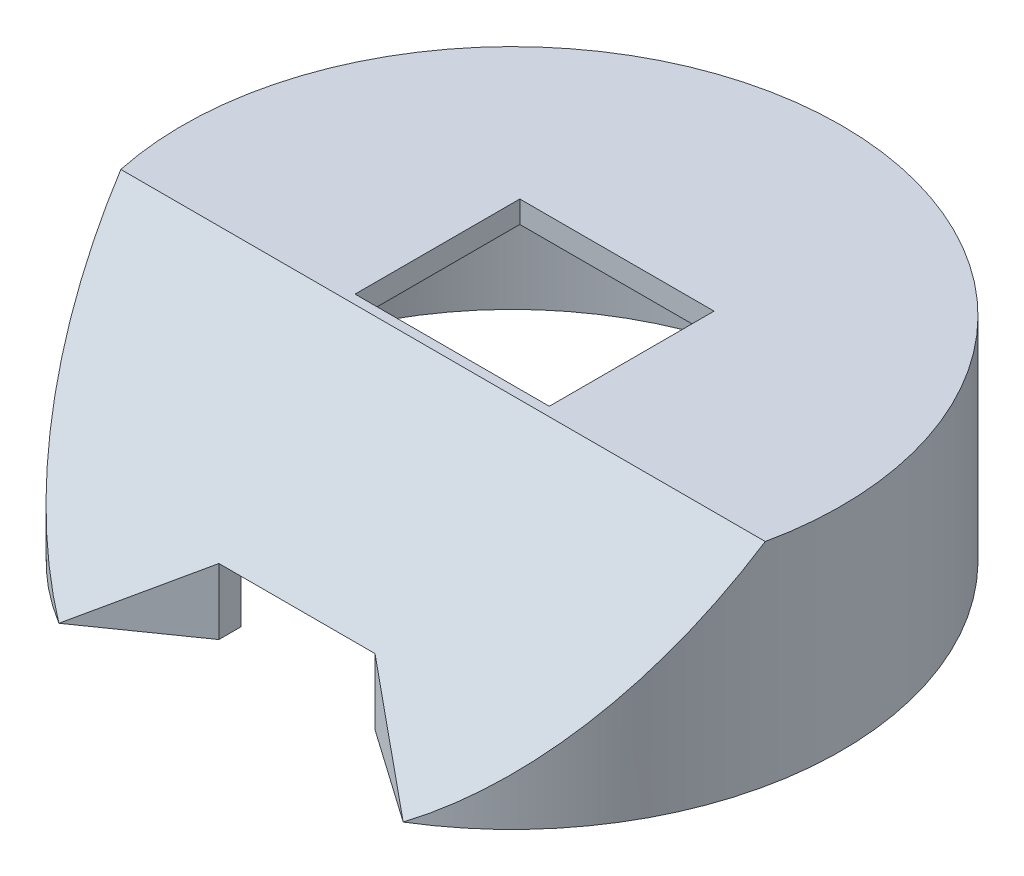
ISO-10303-21;
HEADER;
FILE_DESCRIPTION(('STEP AP214'),'2;1');
FILE_NAME('part.step','',(''),(''),'','','');
FILE_SCHEMA(('AUTOMOTIVE_DESIGN { 1 0 10303 214 1 1 1 1 }'));
ENDSEC;
DATA;
#1=APPLICATION_CONTEXT('core data for automotive mechanical design processes');
#2=APPLICATION_PROTOCOL_DEFINITION('international standard','automotive_design',2000,#1);
#3=PRODUCT_CONTEXT('',#1,'mechanical');
#4=PRODUCT('Part','Part','',(#3));
#5=PRODUCT_RELATED_PRODUCT_CATEGORY('part','',(#4));
#6=PRODUCT_DEFINITION_FORMATION('','',#4);
#7=PRODUCT_DEFINITION_CONTEXT('part definition',#1,'design');
#8=PRODUCT_DEFINITION('design','',#6,#7);
#9=PRODUCT_DEFINITION_SHAPE('','',#8);
#10=(LENGTH_UNIT() NAMED_UNIT(*) SI_UNIT(.MILLI.,.METRE.));
#11=(NAMED_UNIT(*) PLANE_ANGLE_UNIT() SI_UNIT($,.RADIAN.));
#12=(NAMED_UNIT(*) SI_UNIT($,.STERADIAN.) SOLID_ANGLE_UNIT());
#13=UNCERTAINTY_MEASURE_WITH_UNIT(LENGTH_MEASURE(1.E-05),#10,'distance_accuracy_value','');
#14=(GEOMETRIC_REPRESENTATION_CONTEXT(3) GLOBAL_UNCERTAINTY_ASSIGNED_CONTEXT((#13)) GLOBAL_UNIT_ASSIGNED_CONTEXT((#10,
#11,#12)) REPRESENTATION_CONTEXT('',''));
#15=CARTESIAN_POINT('',(0.,0.,0.));
#16=DIRECTION('',(0.,0.,1.));
#17=DIRECTION('',(1.,0.,0.));
#18=AXIS2_PLACEMENT_3D('',#15,#16,#17);
#19=CARTESIAN_POINT('',(0.,122.25,0.));
#20=DIRECTION('',(0.,1.,0.));
#21=DIRECTION('',(0.,0.,1.));
#22=AXIS2_PLACEMENT_3D('',#19,#20,#21);
#23=PLANE('',#22);
#24=DIRECTION('',(1.,0.,0.));
#25=VECTOR('',#24,1.);
#26=CARTESIAN_POINT('',(-190.000025,122.25,39.7547522635531));
#27=LINE('',#26,#25);
#28=CARTESIAN_POINT('',(-185.794401617658,122.25,39.7547522635531));
#29=VERTEX_POINT('',#28);
#30=CARTESIAN_POINT('',(185.794401617658,122.25,39.7547522635531));
#31=VERTEX_POINT('',#30);
#32=EDGE_CURVE('E262',#29,#31,#27,.T.);
#33=ORIENTED_EDGE('',*,*,#32,.T.);
#34=CARTESIAN_POINT('',(0.,122.25,0.));
#35=DIRECTION('',(0.,1.,0.));
#36=DIRECTION('',(0.,0.,1.));
#37=AXIS2_PLACEMENT_3D('',#34,#35,#36);
#38=CIRCLE('',#37,190.);
#39=EDGE_CURVE('E296',#31,#29,#38,.T.);
#40=ORIENTED_EDGE('',*,*,#39,.T.);
#41=EDGE_LOOP('',(#33,#40));
#42=FACE_BOUND('',#41,.T.);
#43=DIRECTION('',(-1.,0.,0.));
#44=VECTOR('',#43,1.);
#45=CARTESIAN_POINT('',(0.,122.25,-60.5057599785852));
#46=LINE('',#45,#44);
#47=CARTESIAN_POINT('',(56.,122.25,-60.5057599785852));
#48=VERTEX_POINT('',#47);
#49=CARTESIAN_POINT('',(-56.,122.25,-60.5057599785852));
#50=VERTEX_POINT('',#49);
#51=EDGE_CURVE('E363',#48,#50,#46,.T.);
#52=ORIENTED_EDGE('',*,*,#51,.F.);
#53=DIRECTION('',(0.,0.,1.));
#54=VECTOR('',#53,1.);
#55=CARTESIAN_POINT('',(56.,122.25,0.));
#56=LINE('',#55,#54);
#57=CARTESIAN_POINT('',(56.,122.25,34.4942400214148));
#58=VERTEX_POINT('',#57);
#59=EDGE_CURVE('E348',#48,#58,#56,.T.);
#60=ORIENTED_EDGE('',*,*,#59,.T.);
#61=DIRECTION('',(1.,0.,0.));
#62=VECTOR('',#61,1.);
#63=CARTESIAN_POINT('',(0.,122.25,34.4942400214148));
#64=LINE('',#63,#62);
#65=CARTESIAN_POINT('',(-56.,122.25,34.4942400214148));
#66=VERTEX_POINT('',#65);
#67=EDGE_CURVE('E352',#66,#58,#64,.T.);
#68=ORIENTED_EDGE('',*,*,#67,.F.);
#69=DIRECTION('',(0.,0.,1.));
#70=VECTOR('',#69,1.);
#71=CARTESIAN_POINT('',(-56.,122.25,0.));
#72=LINE('',#71,#70);
#73=EDGE_CURVE('E170',#50,#66,#72,.T.);
#74=ORIENTED_EDGE('',*,*,#73,.F.);
#75=EDGE_LOOP('',(#52,#60,#68,#74));
#76=FACE_BOUND('',#75,.T.);
#77=ADVANCED_FACE('F45',(#42,#76),#23,.T.);
#78=CARTESIAN_POINT('',(0.,109.55,0.));
#79=DIRECTION('',(0.,1.,0.));
#80=DIRECTION('',(0.,0.,1.));
#81=AXIS2_PLACEMENT_3D('',#78,#79,#80);
#82=PLANE('',#81);
#83=DIRECTION('',(0.,0.,1.));
#84=VECTOR('',#83,1.);
#85=CARTESIAN_POINT('',(56.,109.55,0.));
#86=LINE('',#85,#84);
#87=CARTESIAN_POINT('',(56.,109.55,-60.5057599785852));
#88=VERTEX_POINT('',#87);
#89=CARTESIAN_POINT('',(56.,109.55,34.4942400214148));
#90=VERTEX_POINT('',#89);
#91=EDGE_CURVE('E11',#88,#90,#86,.T.);
#92=ORIENTED_EDGE('',*,*,#91,.F.);
#93=DIRECTION('',(-1.,0.,0.));
#94=VECTOR('',#93,1.);
#95=CARTESIAN_POINT('',(0.,109.55,-60.5057599785852));
#96=LINE('',#95,#94);
#97=CARTESIAN_POINT('',(-56.,109.55,-60.5057599785852));
#98=VERTEX_POINT('',#97);
#99=EDGE_CURVE('E54',#88,#98,#96,.T.);
#100=ORIENTED_EDGE('',*,*,#99,.T.);
#101=DIRECTION('',(0.,0.,1.));
#102=VECTOR('',#101,1.);
#103=CARTESIAN_POINT('',(-56.,109.55,0.));
#104=LINE('',#103,#102);
#105=CARTESIAN_POINT('',(-56.,109.55,34.4942400214148));
#106=VERTEX_POINT('',#105);
#107=EDGE_CURVE('E167',#98,#106,#104,.T.);
#108=ORIENTED_EDGE('',*,*,#107,.T.);
#109=DIRECTION('',(1.,0.,0.));
#110=VECTOR('',#109,1.);
#111=CARTESIAN_POINT('',(-190.000025,109.55,34.4942400214148));
#112=LINE('',#111,#110);
#113=CARTESIAN_POINT('',(-173.912154277224,109.55,34.4942400214148));
#114=VERTEX_POINT('',#113);
#115=EDGE_CURVE('E160',#114,#106,#112,.T.);
#116=ORIENTED_EDGE('',*,*,#115,.F.);
#117=CARTESIAN_POINT('',(0.,109.55,0.));
#118=DIRECTION('',(0.,1.,0.));
#119=DIRECTION('',(0.,0.,1.));
#120=AXIS2_PLACEMENT_3D('',#117,#118,#119);
#121=CIRCLE('',#120,177.3);
#122=CARTESIAN_POINT('',(173.912154277224,109.55,34.4942400214148));
#123=VERTEX_POINT('',#122);
#124=EDGE_CURVE('E215',#123,#114,#121,.T.);
#125=ORIENTED_EDGE('',*,*,#124,.F.);
#126=EDGE_CURVE('E161',#90,#123,#112,.T.);
#127=ORIENTED_EDGE('',*,*,#126,.F.);
#128=EDGE_LOOP('',(#92,#100,#108,#116,#125,#127));
#129=FACE_BOUND('',#128,.T.);
#130=ADVANCED_FACE('F178',(#129),#82,.F.);
#131=CARTESIAN_POINT('',(0.,122.25,111.304758263554));
#132=DIRECTION('',(0.,0.,-1.));
#133=DIRECTION('',(-1.,0.,0.));
#134=AXIS2_PLACEMENT_3D('',#131,#132,#133);
#135=PLANE('',#134);
#136=DIRECTION('',(0.,1.,0.));
#137=VECTOR('',#136,1.);
#138=CARTESIAN_POINT('',(-45.,122.25,111.304758263554));
#139=LINE('',#138,#137);
#140=CARTESIAN_POINT('',(-45.,0.,111.304758263554));
#141=VERTEX_POINT('',#140);
#142=CARTESIAN_POINT('',(-45.,32.7394817578613,111.304758263554));
#143=VERTEX_POINT('',#142);
#144=EDGE_CURVE('E197',#141,#143,#139,.T.);
#145=ORIENTED_EDGE('',*,*,#144,.F.);
#146=DIRECTION('',(-1.,0.,0.));
#147=VECTOR('',#146,1.);
#148=CARTESIAN_POINT('',(0.,0.,111.304758263554));
#149=LINE('',#148,#147);
#150=CARTESIAN_POINT('',(-49.004294618763,0.,111.304758263554));
#151=VERTEX_POINT('',#150);
#152=EDGE_CURVE('E217',#141,#151,#149,.T.);
#153=ORIENTED_EDGE('',*,*,#152,.T.);
#154=DIRECTION('',(0.,-1.,0.));
#155=VECTOR('',#154,1.);
#156=CARTESIAN_POINT('',(-49.004294618763,122.25,111.304758263554));
#157=LINE('',#156,#155);
#158=CARTESIAN_POINT('',(-49.004294618763,32.7394817578613,111.304758263554));
#159=VERTEX_POINT('',#158);
#160=EDGE_CURVE('E213',#159,#151,#157,.T.);
#161=ORIENTED_EDGE('',*,*,#160,.F.);
#162=DIRECTION('',(-1.,0.,0.));
#163=VECTOR('',#162,1.);
#164=CARTESIAN_POINT('',(0.,32.7394817578613,111.304758263554));
#165=LINE('',#164,#163);
#166=EDGE_CURVE('E233',#143,#159,#165,.T.);
#167=ORIENTED_EDGE('',*,*,#166,.F.);
#168=EDGE_LOOP('',(#145,#153,#161,#167));
#169=FACE_BOUND('',#168,.T.);
#170=ADVANCED_FACE('F333',(#169),#135,.T.);
#171=CARTESIAN_POINT('',(0.,122.25,0.));
#172=DIRECTION('',(0.,-1.,0.));
#173=DIRECTION('',(0.,0.,-1.));
#174=AXIS2_PLACEMENT_3D('',#171,#172,#173);
#175=CYLINDRICAL_SURFACE('',#174,190.);
#176=CARTESIAN_POINT('',(0.,0.,0.));
#177=DIRECTION('',(0.,1.,0.));
#178=DIRECTION('',(0.,0.,1.));
#179=AXIS2_PLACEMENT_3D('',#176,#177,#178);
#180=CIRCLE('',#179,190.);
#181=CARTESIAN_POINT('',(99.2696242562011,-5.99999999684186E-06,162.004758263554));
#182=VERTEX_POINT('',#181);
#183=CARTESIAN_POINT('',(-99.269624256201,-5.99999999684186E-06,162.004758263554));
#184=VERTEX_POINT('',#183);
#185=EDGE_CURVE('E293',#182,#184,#180,.T.);
#186=ORIENTED_EDGE('',*,*,#185,.T.);
#187=CARTESIAN_POINT('',(0.,162.004752263553,0.));
#188=DIRECTION('',(0.,-0.707106781186551,-0.707106781186544));
#189=DIRECTION('',(0.,-0.707106781186544,0.707106781186551));
#190=AXIS2_PLACEMENT_3D('',#187,#188,#189);
#191=ELLIPSE('',#190,268.700576850887,190.);
#192=EDGE_CURVE('E281',#184,#29,#191,.T.);
#193=ORIENTED_EDGE('',*,*,#192,.T.);
#194=ORIENTED_EDGE('',*,*,#39,.F.);
#195=EDGE_CURVE('E275',#31,#182,#191,.T.);
#196=ORIENTED_EDGE('',*,*,#195,.T.);
#197=EDGE_LOOP('',(#186,#193,#194,#196));
#198=FACE_BOUND('',#197,.T.);
#199=ADVANCED_FACE('F47',(#198),#175,.T.);
#200=CARTESIAN_POINT('',(0.,0.,0.));
#201=DIRECTION('',(0.,1.,0.));
#202=DIRECTION('',(0.,0.,1.));
#203=AXIS2_PLACEMENT_3D('',#200,#201,#202);
#204=PLANE('',#203);
#205=ORIENTED_EDGE('',*,*,#152,.F.);
#206=DIRECTION('',(0.,0.,-1.));
#207=VECTOR('',#206,1.);
#208=CARTESIAN_POINT('',(-45.,0.,0.));
#209=LINE('',#208,#207);
#210=CARTESIAN_POINT('',(-45.,0.,124.004758263554));
#211=VERTEX_POINT('',#210);
#212=EDGE_CURVE('E368',#211,#141,#209,.T.);
#213=ORIENTED_EDGE('',*,*,#212,.F.);
#214=DIRECTION('',(0.819152044288995,0.,-0.573576436351042));
#215=VECTOR('',#214,1.);
#216=CARTESIAN_POINT('',(43.4586313661287,0.,62.0653577612778));
#217=LINE('',#216,#215);
#218=EDGE_CURVE('E309',#184,#211,#217,.T.);
#219=ORIENTED_EDGE('',*,*,#218,.F.);
#220=ORIENTED_EDGE('',*,*,#185,.F.);
#221=DIRECTION('',(0.819152044288995,0.,0.573576436351042));
#222=VECTOR('',#221,1.);
#223=CARTESIAN_POINT('',(-43.4586313661287,0.,62.0653577612778));
#224=LINE('',#223,#222);
#225=CARTESIAN_POINT('',(45.,0.,124.004758263554));
#226=VERTEX_POINT('',#225);
#227=EDGE_CURVE('E300',#226,#182,#224,.T.);
#228=ORIENTED_EDGE('',*,*,#227,.F.);
#229=DIRECTION('',(0.,0.,1.));
#230=VECTOR('',#229,1.);
#231=CARTESIAN_POINT('',(45.,0.,0.));
#232=LINE('',#231,#230);
#233=CARTESIAN_POINT('',(45.,0.,111.304758263554));
#234=VERTEX_POINT('',#233);
#235=EDGE_CURVE('E372',#234,#226,#232,.T.);
#236=ORIENTED_EDGE('',*,*,#235,.F.);
#237=CARTESIAN_POINT('',(49.0042946187631,0.,111.304758263554));
#238=VERTEX_POINT('',#237);
#239=EDGE_CURVE('E249',#238,#234,#149,.T.);
#240=ORIENTED_EDGE('',*,*,#239,.F.);
#241=DIRECTION('',(0.819152044288995,0.,0.573576436351042));
#242=VECTOR('',#241,1.);
#243=CARTESIAN_POINT('',(-36.1742106244705,0.,51.6621267988076));
#244=LINE('',#243,#242);
#245=CARTESIAN_POINT('',(95.7611202330235,0.,144.044240021416));
#246=VERTEX_POINT('',#245);
#247=EDGE_CURVE('E244',#238,#246,#244,.T.);
#248=ORIENTED_EDGE('',*,*,#247,.T.);
#249=DIRECTION('',(-1.,0.,0.));
#250=VECTOR('',#249,1.);
#251=CARTESIAN_POINT('',(0.,0.,144.044240021416));
#252=LINE('',#251,#250);
#253=CARTESIAN_POINT('',(103.375755942352,0.,144.044240021416));
#254=VERTEX_POINT('',#253);
#255=EDGE_CURVE('E232',#254,#246,#252,.T.);
#256=ORIENTED_EDGE('',*,*,#255,.F.);
#257=CARTESIAN_POINT('',(0.,0.,0.));
#258=DIRECTION('',(0.,1.,0.));
#259=DIRECTION('',(0.,0.,1.));
#260=AXIS2_PLACEMENT_3D('',#257,#258,#259);
#261=CIRCLE('',#260,177.3);
#262=CARTESIAN_POINT('',(-103.375755942352,0.,144.044240021416));
#263=VERTEX_POINT('',#262);
#264=EDGE_CURVE('E218',#254,#263,#261,.T.);
#265=ORIENTED_EDGE('',*,*,#264,.T.);
#266=DIRECTION('',(1.,0.,0.));
#267=VECTOR('',#266,1.);
#268=CARTESIAN_POINT('',(-190.000025,0.,144.044240021416));
#269=LINE('',#268,#267);
#270=CARTESIAN_POINT('',(-95.7611202330235,0.,144.044240021416));
#271=VERTEX_POINT('',#270);
#272=EDGE_CURVE('E258',#263,#271,#269,.T.);
#273=ORIENTED_EDGE('',*,*,#272,.T.);
#274=DIRECTION('',(0.819152044288995,0.,-0.573576436351042));
#275=VECTOR('',#274,1.);
#276=CARTESIAN_POINT('',(36.1742106244705,0.,51.6621267988075));
#277=LINE('',#276,#275);
#278=EDGE_CURVE('E248',#271,#151,#277,.T.);
#279=ORIENTED_EDGE('',*,*,#278,.T.);
#280=EDGE_LOOP('',(#205,#213,#219,#220,#228,#236,#240,#248,#256,#265,#273,#279));
#281=FACE_BOUND('',#280,.T.);
#282=ADVANCED_FACE('F338',(#281),#204,.F.);
#283=CARTESIAN_POINT('',(43.4586313661287,122.25,62.0653577612778));
#284=DIRECTION('',(0.573576436351042,0.,0.819152044288995));
#285=DIRECTION('',(0.819152044288995,0.,-0.573576436351042));
#286=AXIS2_PLACEMENT_3D('',#283,#284,#285);
#287=PLANE('',#286);
#288=DIRECTION('',(0.710564775461636,0.497542812164516,-0.497542812164522));
#289=VECTOR('',#288,1.);
#290=CARTESIAN_POINT('',(51.346242439942,105.462359234626,56.5423930289274));
#291=LINE('',#290,#289);
#292=CARTESIAN_POINT('',(-45.,37.9999939999996,124.004758263554));
#293=VERTEX_POINT('',#292);
#294=EDGE_CURVE('E269',#184,#293,#291,.T.);
#295=ORIENTED_EDGE('',*,*,#294,.F.);
#296=ORIENTED_EDGE('',*,*,#218,.T.);
#297=DIRECTION('',(0.,-1.,0.));
#298=VECTOR('',#297,1.);
#299=CARTESIAN_POINT('',(-45.,122.25,124.004758263554));
#300=LINE('',#299,#298);
#301=EDGE_CURVE('E288',#293,#211,#300,.T.);
#302=ORIENTED_EDGE('',*,*,#301,.F.);
#303=EDGE_LOOP('',(#295,#296,#302));
#304=FACE_BOUND('',#303,.T.);
#305=ADVANCED_FACE('F440',(#304),#287,.T.);
#306=CARTESIAN_POINT('',(-43.4586313661287,122.25,62.0653577612778));
#307=DIRECTION('',(-0.573576436351041,0.,0.819152044288995));
#308=DIRECTION('',(0.819152044288995,0.,0.573576436351042));
#309=AXIS2_PLACEMENT_3D('',#306,#307,#308);
#310=PLANE('',#309);
#311=DIRECTION('',(0.710564775461636,-0.497542812164516,0.497542812164521));
#312=VECTOR('',#311,1.);
#313=CARTESIAN_POINT('',(-51.346242439942,105.462359234626,56.5423930289274));
#314=LINE('',#313,#312);
#315=CARTESIAN_POINT('',(45.,37.9999939999996,124.004758263554));
#316=VERTEX_POINT('',#315);
#317=EDGE_CURVE('E266',#316,#182,#314,.T.);
#318=ORIENTED_EDGE('',*,*,#317,.F.);
#319=DIRECTION('',(0.,-1.,0.));
#320=VECTOR('',#319,1.);
#321=CARTESIAN_POINT('',(45.,122.25,124.004758263554));
#322=LINE('',#321,#320);
#323=EDGE_CURVE('E289',#316,#226,#322,.T.);
#324=ORIENTED_EDGE('',*,*,#323,.T.);
#325=ORIENTED_EDGE('',*,*,#227,.T.);
#326=EDGE_LOOP('',(#318,#324,#325));
#327=FACE_BOUND('',#326,.T.);
#328=ADVANCED_FACE('F387',(#327),#310,.T.);
#329=CARTESIAN_POINT('',(-190.000025,81.0023761317772,81.0023761317763));
#330=DIRECTION('',(0.,-0.707106781186551,-0.707106781186544));
#331=DIRECTION('',(0.,0.707106781186544,-0.707106781186551));
#332=AXIS2_PLACEMENT_3D('',#329,#330,#331);
#333=PLANE('',#332);
#334=ORIENTED_EDGE('',*,*,#294,.T.);
#335=DIRECTION('',(-1.,0.,0.));
#336=VECTOR('',#335,1.);
#337=CARTESIAN_POINT('',(0.,37.9999939999996,124.004758263554));
#338=LINE('',#337,#336);
#339=EDGE_CURVE('E315',#316,#293,#338,.T.);
#340=ORIENTED_EDGE('',*,*,#339,.F.);
#341=ORIENTED_EDGE('',*,*,#317,.T.);
#342=ORIENTED_EDGE('',*,*,#195,.F.);
#343=ORIENTED_EDGE('',*,*,#32,.F.);
#344=ORIENTED_EDGE('',*,*,#192,.F.);
#345=EDGE_LOOP('',(#334,#340,#341,#342,#343,#344));
#346=FACE_BOUND('',#345,.T.);
#347=ADVANCED_FACE('F393',(#346),#333,.F.);
#348=CARTESIAN_POINT('',(0.,122.25,0.));
#349=DIRECTION('',(0.,-1.,0.));
#350=DIRECTION('',(0.,0.,-1.));
#351=AXIS2_PLACEMENT_3D('',#348,#349,#350);
#352=CYLINDRICAL_SURFACE('',#351,177.3);
#353=ORIENTED_EDGE('',*,*,#264,.F.);
#354=CARTESIAN_POINT('',(0.,144.044240021414,0.));
#355=DIRECTION('',(0.,-0.707106781186551,-0.707106781186544));
#356=DIRECTION('',(0.,-0.707106781186544,0.707106781186551));
#357=AXIS2_PLACEMENT_3D('',#354,#355,#356);
#358=ELLIPSE('',#357,250.740064608748,177.3);
#359=EDGE_CURVE('E214',#123,#254,#358,.T.);
#360=ORIENTED_EDGE('',*,*,#359,.F.);
#361=ORIENTED_EDGE('',*,*,#124,.T.);
#362=CARTESIAN_POINT('',(0.,144.044240021414,0.));
#363=DIRECTION('',(0.,-0.707106781186551,-0.707106781186544));
#364=DIRECTION('',(0.,-0.707106781186544,0.707106781186551));
#365=AXIS2_PLACEMENT_3D('',#362,#363,#364);
#366=ELLIPSE('',#365,250.740064608748,177.3);
#367=EDGE_CURVE('E187',#263,#114,#366,.T.);
#368=ORIENTED_EDGE('',*,*,#367,.F.);
#369=EDGE_LOOP('',(#353,#360,#361,#368));
#370=FACE_BOUND('',#369,.T.);
#371=ADVANCED_FACE('F341',(#370),#352,.F.);
#372=CARTESIAN_POINT('',(36.1742106244705,122.25,51.6621267988075));
#373=DIRECTION('',(0.573576436351042,0.,0.819152044288995));
#374=DIRECTION('',(0.819152044288995,0.,-0.573576436351042));
#375=AXIS2_PLACEMENT_3D('',#372,#373,#374);
#376=PLANE('',#375);
#377=DIRECTION('',(0.710564775461636,0.497542812164516,-0.497542812164522));
#378=VECTOR('',#377,1.);
#379=CARTESIAN_POINT('',(46.7335956900525,99.7758742443868,44.2683657770281));
#380=LINE('',#379,#378);
#381=EDGE_CURVE('E192',#271,#159,#380,.T.);
#382=ORIENTED_EDGE('',*,*,#381,.T.);
#383=ORIENTED_EDGE('',*,*,#160,.T.);
#384=ORIENTED_EDGE('',*,*,#278,.F.);
#385=EDGE_LOOP('',(#382,#383,#384));
#386=FACE_BOUND('',#385,.T.);
#387=ADVANCED_FACE('F337',(#386),#376,.F.);
#388=CARTESIAN_POINT('',(-36.1742106244705,122.25,51.6621267988075));
#389=DIRECTION('',(-0.573576436351041,0.,0.819152044288995));
#390=DIRECTION('',(0.819152044288995,0.,0.573576436351042));
#391=AXIS2_PLACEMENT_3D('',#388,#389,#390);
#392=PLANE('',#391);
#393=DIRECTION('',(0.710564775461636,-0.497542812164516,0.497542812164521));
#394=VECTOR('',#393,1.);
#395=CARTESIAN_POINT('',(-46.7335956900525,99.7758742443868,44.2683657770281));
#396=LINE('',#395,#394);
#397=CARTESIAN_POINT('',(49.0042946187631,32.7394817578613,111.304758263554));
#398=VERTEX_POINT('',#397);
#399=EDGE_CURVE('E190',#398,#246,#396,.T.);
#400=ORIENTED_EDGE('',*,*,#399,.T.);
#401=ORIENTED_EDGE('',*,*,#247,.F.);
#402=DIRECTION('',(0.,-1.,0.));
#403=VECTOR('',#402,1.);
#404=CARTESIAN_POINT('',(49.0042946187631,122.25,111.304758263554));
#405=LINE('',#404,#403);
#406=EDGE_CURVE('E237',#398,#238,#405,.T.);
#407=ORIENTED_EDGE('',*,*,#406,.F.);
#408=EDGE_LOOP('',(#400,#401,#407));
#409=FACE_BOUND('',#408,.T.);
#410=ADVANCED_FACE('F426',(#409),#392,.F.);
#411=DIRECTION('',(0.,-1.,0.));
#412=VECTOR('',#411,1.);
#413=CARTESIAN_POINT('',(45.,122.25,111.304758263554));
#414=LINE('',#413,#412);
#415=CARTESIAN_POINT('',(45.,32.7394817578613,111.304758263554));
#416=VERTEX_POINT('',#415);
#417=EDGE_CURVE('E201',#416,#234,#414,.T.);
#418=ORIENTED_EDGE('',*,*,#417,.F.);
#419=EDGE_CURVE('E229',#398,#416,#165,.T.);
#420=ORIENTED_EDGE('',*,*,#419,.F.);
#421=ORIENTED_EDGE('',*,*,#406,.T.);
#422=ORIENTED_EDGE('',*,*,#239,.T.);
#423=EDGE_LOOP('',(#418,#420,#421,#422));
#424=FACE_BOUND('',#423,.T.);
#425=ADVANCED_FACE('F429',(#424),#135,.T.);
#426=CARTESIAN_POINT('',(-190.000025,72.022120010708,72.0221200107072));
#427=DIRECTION('',(0.,-0.707106781186551,-0.707106781186544));
#428=DIRECTION('',(0.,0.707106781186544,-0.707106781186551));
#429=AXIS2_PLACEMENT_3D('',#426,#427,#428);
#430=PLANE('',#429);
#431=DIRECTION('',(0.,0.707106781186544,-0.707106781186551));
#432=VECTOR('',#431,1.);
#433=CARTESIAN_POINT('',(-45.,72.022120010708,72.0221200107072));
#434=LINE('',#433,#432);
#435=CARTESIAN_POINT('',(-45.,37.9999939999996,106.044246021416));
#436=VERTEX_POINT('',#435);
#437=EDGE_CURVE('E182',#143,#436,#434,.T.);
#438=ORIENTED_EDGE('',*,*,#437,.F.);
#439=ORIENTED_EDGE('',*,*,#166,.T.);
#440=ORIENTED_EDGE('',*,*,#381,.F.);
#441=ORIENTED_EDGE('',*,*,#272,.F.);
#442=ORIENTED_EDGE('',*,*,#367,.T.);
#443=ORIENTED_EDGE('',*,*,#115,.T.);
#444=EDGE_CURVE('E155',#106,#90,#112,.T.);
#445=ORIENTED_EDGE('',*,*,#444,.T.);
#446=ORIENTED_EDGE('',*,*,#126,.T.);
#447=ORIENTED_EDGE('',*,*,#359,.T.);
#448=ORIENTED_EDGE('',*,*,#255,.T.);
#449=ORIENTED_EDGE('',*,*,#399,.F.);
#450=ORIENTED_EDGE('',*,*,#419,.T.);
#451=DIRECTION('',(0.,-0.707106781186544,0.707106781186551));
#452=VECTOR('',#451,1.);
#453=CARTESIAN_POINT('',(45.,72.022120010708,72.0221200107072));
#454=LINE('',#453,#452);
#455=CARTESIAN_POINT('',(45.,37.9999939999996,106.044246021416));
#456=VERTEX_POINT('',#455);
#457=EDGE_CURVE('E324',#456,#416,#454,.T.);
#458=ORIENTED_EDGE('',*,*,#457,.F.);
#459=DIRECTION('',(-1.,0.,0.));
#460=VECTOR('',#459,1.);
#461=CARTESIAN_POINT('',(-190.000025,37.9999939999996,106.044246021416));
#462=LINE('',#461,#460);
#463=EDGE_CURVE('E320',#456,#436,#462,.T.);
#464=ORIENTED_EDGE('',*,*,#463,.T.);
#465=EDGE_LOOP('',(#438,#439,#440,#441,#442,#443,#445,#446,#447,#448,#449,#450,#458,#464));
#466=FACE_BOUND('',#465,.T.);
#467=ADVANCED_FACE('F185',(#466),#430,.T.);
#468=CARTESIAN_POINT('',(-45.,37.9999939999996,0.));
#469=DIRECTION('',(-1.,0.,0.));
#470=DIRECTION('',(0.,0.,1.));
#471=AXIS2_PLACEMENT_3D('',#468,#469,#470);
#472=PLANE('',#471);
#473=ORIENTED_EDGE('',*,*,#212,.T.);
#474=ORIENTED_EDGE('',*,*,#144,.T.);
#475=ORIENTED_EDGE('',*,*,#437,.T.);
#476=DIRECTION('',(0.,0.,-1.));
#477=VECTOR('',#476,1.);
#478=CARTESIAN_POINT('',(-45.,37.9999939999996,0.));
#479=LINE('',#478,#477);
#480=EDGE_CURVE('E369',#293,#436,#479,.T.);
#481=ORIENTED_EDGE('',*,*,#480,.F.);
#482=ORIENTED_EDGE('',*,*,#301,.T.);
#483=EDGE_LOOP('',(#473,#474,#475,#481,#482));
#484=FACE_BOUND('',#483,.T.);
#485=ADVANCED_FACE('F417',(#484),#472,.F.);
#486=CARTESIAN_POINT('',(45.,37.9999939999996,0.));
#487=DIRECTION('',(1.,0.,0.));
#488=DIRECTION('',(0.,0.,-1.));
#489=AXIS2_PLACEMENT_3D('',#486,#487,#488);
#490=PLANE('',#489);
#491=DIRECTION('',(0.,0.,1.));
#492=VECTOR('',#491,1.);
#493=CARTESIAN_POINT('',(45.,37.9999939999996,0.));
#494=LINE('',#493,#492);
#495=EDGE_CURVE('E207',#456,#316,#494,.T.);
#496=ORIENTED_EDGE('',*,*,#495,.F.);
#497=ORIENTED_EDGE('',*,*,#457,.T.);
#498=ORIENTED_EDGE('',*,*,#417,.T.);
#499=ORIENTED_EDGE('',*,*,#235,.T.);
#500=ORIENTED_EDGE('',*,*,#323,.F.);
#501=EDGE_LOOP('',(#496,#497,#498,#499,#500));
#502=FACE_BOUND('',#501,.T.);
#503=ADVANCED_FACE('F381',(#502),#490,.F.);
#504=CARTESIAN_POINT('',(0.,37.9999939999996,0.));
#505=DIRECTION('',(0.,-1.,0.));
#506=DIRECTION('',(0.,0.,-1.));
#507=AXIS2_PLACEMENT_3D('',#504,#505,#506);
#508=PLANE('',#507);
#509=ORIENTED_EDGE('',*,*,#339,.T.);
#510=ORIENTED_EDGE('',*,*,#480,.T.);
#511=ORIENTED_EDGE('',*,*,#463,.F.);
#512=ORIENTED_EDGE('',*,*,#495,.T.);
#513=EDGE_LOOP('',(#509,#510,#511,#512));
#514=FACE_BOUND('',#513,.T.);
#515=ADVANCED_FACE('F407',(#514),#508,.T.);
#516=CARTESIAN_POINT('',(56.,122.250025,0.));
#517=DIRECTION('',(-1.,0.,0.));
#518=DIRECTION('',(0.,0.,1.));
#519=AXIS2_PLACEMENT_3D('',#516,#517,#518);
#520=PLANE('',#519);
#521=DIRECTION('',(0.,-1.,0.));
#522=VECTOR('',#521,1.);
#523=CARTESIAN_POINT('',(56.,122.250025,-60.5057599785852));
#524=LINE('',#523,#522);
#525=EDGE_CURVE('E347',#48,#88,#524,.T.);
#526=ORIENTED_EDGE('',*,*,#525,.T.);
#527=ORIENTED_EDGE('',*,*,#91,.T.);
#528=DIRECTION('',(0.,-1.,0.));
#529=VECTOR('',#528,1.);
#530=CARTESIAN_POINT('',(56.,122.250025,34.4942400214148));
#531=LINE('',#530,#529);
#532=EDGE_CURVE('E66',#58,#90,#531,.T.);
#533=ORIENTED_EDGE('',*,*,#532,.F.);
#534=ORIENTED_EDGE('',*,*,#59,.F.);
#535=EDGE_LOOP('',(#526,#527,#533,#534));
#536=FACE_BOUND('',#535,.T.);
#537=ADVANCED_FACE('F344',(#536),#520,.T.);
#538=CARTESIAN_POINT('',(0.,122.250025,-60.5057599785852));
#539=DIRECTION('',(0.,0.,-1.));
#540=DIRECTION('',(-1.,0.,0.));
#541=AXIS2_PLACEMENT_3D('',#538,#539,#540);
#542=PLANE('',#541);
#543=ORIENTED_EDGE('',*,*,#51,.T.);
#544=DIRECTION('',(0.,-1.,0.));
#545=VECTOR('',#544,1.);
#546=CARTESIAN_POINT('',(-56.,122.250025,-60.5057599785852));
#547=LINE('',#546,#545);
#548=EDGE_CURVE('E173',#50,#98,#547,.T.);
#549=ORIENTED_EDGE('',*,*,#548,.T.);
#550=ORIENTED_EDGE('',*,*,#99,.F.);
#551=ORIENTED_EDGE('',*,*,#525,.F.);
#552=EDGE_LOOP('',(#543,#549,#550,#551));
#553=FACE_BOUND('',#552,.T.);
#554=ADVANCED_FACE('F399',(#553),#542,.F.);
#555=CARTESIAN_POINT('',(-56.,122.250025,0.));
#556=DIRECTION('',(-1.,0.,0.));
#557=DIRECTION('',(0.,0.,1.));
#558=AXIS2_PLACEMENT_3D('',#555,#556,#557);
#559=PLANE('',#558);
#560=ORIENTED_EDGE('',*,*,#73,.T.);
#561=DIRECTION('',(0.,-1.,0.));
#562=VECTOR('',#561,1.);
#563=CARTESIAN_POINT('',(-56.,122.250025,34.4942400214148));
#564=LINE('',#563,#562);
#565=EDGE_CURVE('E61',#66,#106,#564,.T.);
#566=ORIENTED_EDGE('',*,*,#565,.T.);
#567=ORIENTED_EDGE('',*,*,#107,.F.);
#568=ORIENTED_EDGE('',*,*,#548,.F.);
#569=EDGE_LOOP('',(#560,#566,#567,#568));
#570=FACE_BOUND('',#569,.T.);
#571=ADVANCED_FACE('F165',(#570),#559,.F.);
#572=CARTESIAN_POINT('',(0.,122.250025,34.4942400214148));
#573=DIRECTION('',(0.,0.,1.));
#574=DIRECTION('',(1.,0.,0.));
#575=AXIS2_PLACEMENT_3D('',#572,#573,#574);
#576=PLANE('',#575);
#577=ORIENTED_EDGE('',*,*,#67,.T.);
#578=ORIENTED_EDGE('',*,*,#532,.T.);
#579=ORIENTED_EDGE('',*,*,#444,.F.);
#580=ORIENTED_EDGE('',*,*,#565,.F.);
#581=EDGE_LOOP('',(#577,#578,#579,#580));
#582=FACE_BOUND('',#581,.T.);
#583=ADVANCED_FACE('F156',(#582),#576,.F.);
#584=CLOSED_SHELL('',(#77,#130,#170,#199,#282,#305,#328,#347,#371,#387,#410,#425,#467,#485,#503,
#515,#537,#554,#571,#583));
#585=MANIFOLD_SOLID_BREP('B2',#584);
#586=ADVANCED_BREP_SHAPE_REPRESENTATION('',(#18,#585),#14);
#587=SHAPE_DEFINITION_REPRESENTATION(#9,#586);
ENDSEC;
END-ISO-10303-21;
